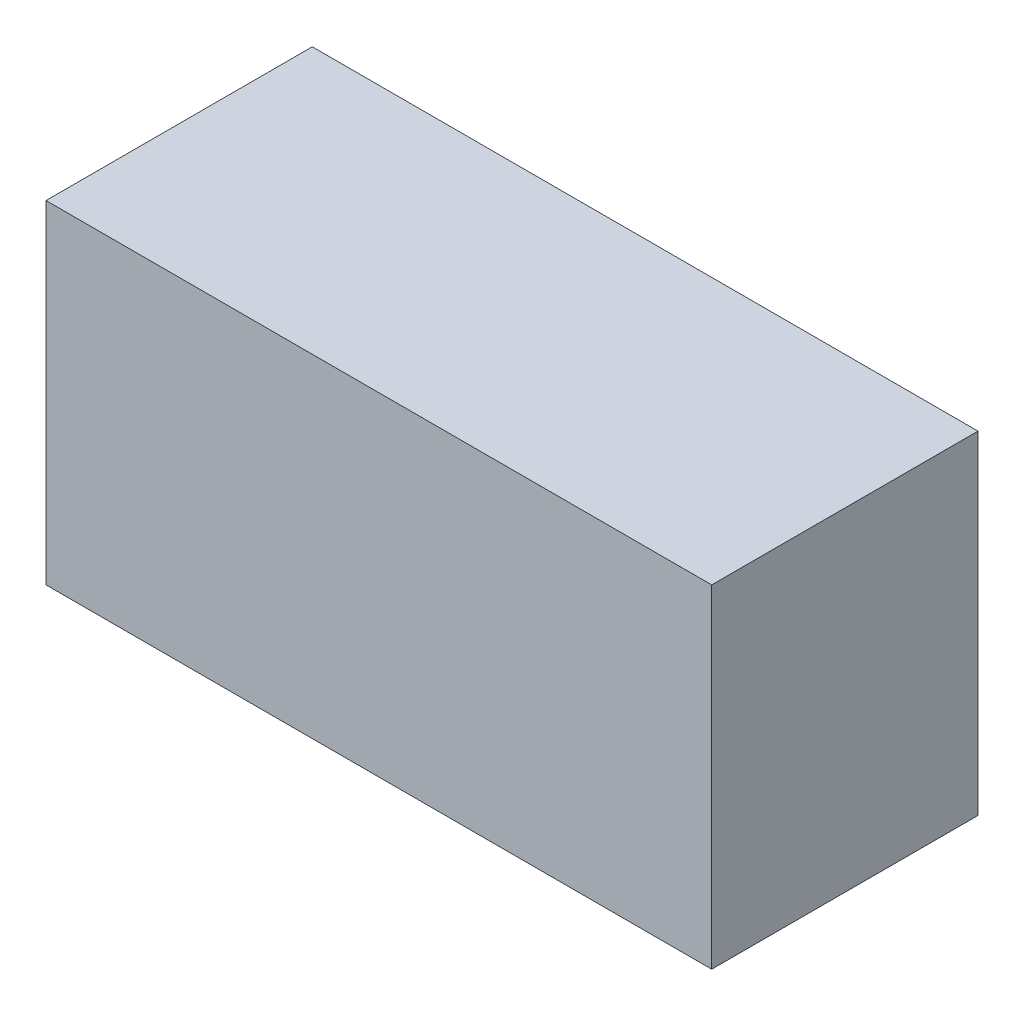
ISO-10303-21;
HEADER;
FILE_DESCRIPTION(('STEP AP214'),'2;1');
FILE_NAME('part.step','',(''),(''),'','','');
FILE_SCHEMA(('AUTOMOTIVE_DESIGN { 1 0 10303 214 1 1 1 1 }'));
ENDSEC;
DATA;
#1=APPLICATION_CONTEXT('core data for automotive mechanical design processes');
#2=APPLICATION_PROTOCOL_DEFINITION('international standard','automotive_design',2000,#1);
#3=PRODUCT_CONTEXT('',#1,'mechanical');
#4=PRODUCT('Part','Part','',(#3));
#5=PRODUCT_RELATED_PRODUCT_CATEGORY('part','',(#4));
#6=PRODUCT_DEFINITION_FORMATION('','',#4);
#7=PRODUCT_DEFINITION_CONTEXT('part definition',#1,'design');
#8=PRODUCT_DEFINITION('design','',#6,#7);
#9=PRODUCT_DEFINITION_SHAPE('','',#8);
#10=(LENGTH_UNIT() NAMED_UNIT(*) SI_UNIT(.MILLI.,.METRE.));
#11=(NAMED_UNIT(*) PLANE_ANGLE_UNIT() SI_UNIT($,.RADIAN.));
#12=(NAMED_UNIT(*) SI_UNIT($,.STERADIAN.) SOLID_ANGLE_UNIT());
#13=UNCERTAINTY_MEASURE_WITH_UNIT(LENGTH_MEASURE(1.E-05),#10,'distance_accuracy_value','');
#14=(GEOMETRIC_REPRESENTATION_CONTEXT(3) GLOBAL_UNCERTAINTY_ASSIGNED_CONTEXT((#13)) GLOBAL_UNIT_ASSIGNED_CONTEXT((#10,
#11,#12)) REPRESENTATION_CONTEXT('',''));
#15=CARTESIAN_POINT('',(0.,0.,0.));
#16=DIRECTION('',(0.,0.,1.));
#17=DIRECTION('',(1.,0.,0.));
#18=AXIS2_PLACEMENT_3D('',#15,#16,#17);
#19=CARTESIAN_POINT('',(100.,50.,80.));
#20=DIRECTION('',(-1.,0.,0.));
#21=DIRECTION('',(0.,0.,1.));
#22=AXIS2_PLACEMENT_3D('',#19,#20,#21);
#23=PLANE('',#22);
#24=DIRECTION('',(0.,1.,0.));
#25=VECTOR('',#24,1.);
#26=CARTESIAN_POINT('',(100.,50.,0.));
#27=LINE('',#26,#25);
#28=CARTESIAN_POINT('',(100.,-50.,0.));
#29=VERTEX_POINT('',#28);
#30=CARTESIAN_POINT('',(100.,50.,0.));
#31=VERTEX_POINT('',#30);
#32=EDGE_CURVE('E141',#29,#31,#27,.T.);
#33=ORIENTED_EDGE('',*,*,#32,.T.);
#34=DIRECTION('',(0.,0.,-1.));
#35=VECTOR('',#34,1.);
#36=CARTESIAN_POINT('',(100.,50.,80.));
#37=LINE('',#36,#35);
#38=CARTESIAN_POINT('',(100.,50.,80.));
#39=VERTEX_POINT('',#38);
#40=EDGE_CURVE('E11',#39,#31,#37,.T.);
#41=ORIENTED_EDGE('',*,*,#40,.F.);
#42=DIRECTION('',(0.,1.,0.));
#43=VECTOR('',#42,1.);
#44=CARTESIAN_POINT('',(100.,50.,80.));
#45=LINE('',#44,#43);
#46=CARTESIAN_POINT('',(100.,-50.,80.));
#47=VERTEX_POINT('',#46);
#48=EDGE_CURVE('E145',#47,#39,#45,.T.);
#49=ORIENTED_EDGE('',*,*,#48,.F.);
#50=DIRECTION('',(0.,0.,-1.));
#51=VECTOR('',#50,1.);
#52=CARTESIAN_POINT('',(100.,-50.,80.));
#53=LINE('',#52,#51);
#54=EDGE_CURVE('E151',#47,#29,#53,.T.);
#55=ORIENTED_EDGE('',*,*,#54,.T.);
#56=EDGE_LOOP('',(#33,#41,#49,#55));
#57=FACE_BOUND('',#56,.T.);
#58=ADVANCED_FACE('F33',(#57),#23,.F.);
#59=CARTESIAN_POINT('',(-100.,50.,80.));
#60=DIRECTION('',(0.,-1.,0.));
#61=DIRECTION('',(0.,0.,-1.));
#62=AXIS2_PLACEMENT_3D('',#59,#60,#61);
#63=PLANE('',#62);
#64=DIRECTION('',(-1.,0.,0.));
#65=VECTOR('',#64,1.);
#66=CARTESIAN_POINT('',(-100.,50.,0.));
#67=LINE('',#66,#65);
#68=CARTESIAN_POINT('',(-100.,50.,0.));
#69=VERTEX_POINT('',#68);
#70=EDGE_CURVE('E154',#31,#69,#67,.T.);
#71=ORIENTED_EDGE('',*,*,#70,.T.);
#72=DIRECTION('',(0.,0.,-1.));
#73=VECTOR('',#72,1.);
#74=CARTESIAN_POINT('',(-100.,50.,80.));
#75=LINE('',#74,#73);
#76=CARTESIAN_POINT('',(-100.,50.,80.));
#77=VERTEX_POINT('',#76);
#78=EDGE_CURVE('E40',#77,#69,#75,.T.);
#79=ORIENTED_EDGE('',*,*,#78,.F.);
#80=DIRECTION('',(-1.,0.,0.));
#81=VECTOR('',#80,1.);
#82=CARTESIAN_POINT('',(-100.,50.,80.));
#83=LINE('',#82,#81);
#84=EDGE_CURVE('E84',#39,#77,#83,.T.);
#85=ORIENTED_EDGE('',*,*,#84,.F.);
#86=ORIENTED_EDGE('',*,*,#40,.T.);
#87=EDGE_LOOP('',(#71,#79,#85,#86));
#88=FACE_BOUND('',#87,.T.);
#89=ADVANCED_FACE('F182',(#88),#63,.F.);
#90=CARTESIAN_POINT('',(-100.,50.,80.));
#91=DIRECTION('',(1.,0.,0.));
#92=DIRECTION('',(0.,0.,-1.));
#93=AXIS2_PLACEMENT_3D('',#90,#91,#92);
#94=PLANE('',#93);
#95=DIRECTION('',(0.,-1.,0.));
#96=VECTOR('',#95,1.);
#97=CARTESIAN_POINT('',(-100.,50.,0.));
#98=LINE('',#97,#96);
#99=CARTESIAN_POINT('',(-100.,-50.,0.));
#100=VERTEX_POINT('',#99);
#101=EDGE_CURVE('E156',#69,#100,#98,.T.);
#102=ORIENTED_EDGE('',*,*,#101,.T.);
#103=DIRECTION('',(0.,0.,-1.));
#104=VECTOR('',#103,1.);
#105=CARTESIAN_POINT('',(-100.,-50.,80.));
#106=LINE('',#105,#104);
#107=CARTESIAN_POINT('',(-100.,-50.,80.));
#108=VERTEX_POINT('',#107);
#109=EDGE_CURVE('E160',#108,#100,#106,.T.);
#110=ORIENTED_EDGE('',*,*,#109,.F.);
#111=DIRECTION('',(0.,-1.,0.));
#112=VECTOR('',#111,1.);
#113=CARTESIAN_POINT('',(-100.,50.,80.));
#114=LINE('',#113,#112);
#115=EDGE_CURVE('E148',#77,#108,#114,.T.);
#116=ORIENTED_EDGE('',*,*,#115,.F.);
#117=ORIENTED_EDGE('',*,*,#78,.T.);
#118=EDGE_LOOP('',(#102,#110,#116,#117));
#119=FACE_BOUND('',#118,.T.);
#120=ADVANCED_FACE('F165',(#119),#94,.F.);
#121=CARTESIAN_POINT('',(-100.,-50.,80.));
#122=DIRECTION('',(0.,1.,0.));
#123=DIRECTION('',(0.,0.,1.));
#124=AXIS2_PLACEMENT_3D('',#121,#122,#123);
#125=PLANE('',#124);
#126=DIRECTION('',(1.,0.,0.));
#127=VECTOR('',#126,1.);
#128=CARTESIAN_POINT('',(-100.,-50.,0.));
#129=LINE('',#128,#127);
#130=EDGE_CURVE('E77',#100,#29,#129,.T.);
#131=ORIENTED_EDGE('',*,*,#130,.T.);
#132=ORIENTED_EDGE('',*,*,#54,.F.);
#133=DIRECTION('',(1.,0.,0.));
#134=VECTOR('',#133,1.);
#135=CARTESIAN_POINT('',(-100.,-50.,80.));
#136=LINE('',#135,#134);
#137=EDGE_CURVE('E56',#108,#47,#136,.T.);
#138=ORIENTED_EDGE('',*,*,#137,.F.);
#139=ORIENTED_EDGE('',*,*,#109,.T.);
#140=EDGE_LOOP('',(#131,#132,#138,#139));
#141=FACE_BOUND('',#140,.T.);
#142=ADVANCED_FACE('F173',(#141),#125,.F.);
#143=CARTESIAN_POINT('',(0.,0.,80.));
#144=DIRECTION('',(0.,0.,1.));
#145=DIRECTION('',(1.,0.,0.));
#146=AXIS2_PLACEMENT_3D('',#143,#144,#145);
#147=PLANE('',#146);
#148=ORIENTED_EDGE('',*,*,#48,.T.);
#149=ORIENTED_EDGE('',*,*,#84,.T.);
#150=ORIENTED_EDGE('',*,*,#115,.T.);
#151=ORIENTED_EDGE('',*,*,#137,.T.);
#152=EDGE_LOOP('',(#148,#149,#150,#151));
#153=FACE_BOUND('',#152,.T.);
#154=ADVANCED_FACE('F175',(#153),#147,.T.);
#155=CARTESIAN_POINT('',(0.,0.,0.));
#156=DIRECTION('',(0.,0.,1.));
#157=DIRECTION('',(1.,0.,0.));
#158=AXIS2_PLACEMENT_3D('',#155,#156,#157);
#159=PLANE('',#158);
#160=DIRECTION('',(1.,0.,0.));
#161=VECTOR('',#160,1.);
#162=CARTESIAN_POINT('',(95.,45.,0.));
#163=LINE('',#162,#161);
#164=CARTESIAN_POINT('',(-95.,45.,0.));
#165=VERTEX_POINT('',#164);
#166=CARTESIAN_POINT('',(95.,45.,0.));
#167=VERTEX_POINT('',#166);
#168=EDGE_CURVE('E135',#165,#167,#163,.T.);
#169=ORIENTED_EDGE('',*,*,#168,.F.);
#170=DIRECTION('',(0.,1.,0.));
#171=VECTOR('',#170,1.);
#172=CARTESIAN_POINT('',(-95.,45.,0.));
#173=LINE('',#172,#171);
#174=CARTESIAN_POINT('',(-95.,-45.,0.));
#175=VERTEX_POINT('',#174);
#176=EDGE_CURVE('E47',#175,#165,#173,.T.);
#177=ORIENTED_EDGE('',*,*,#176,.F.);
#178=DIRECTION('',(-1.,0.,0.));
#179=VECTOR('',#178,1.);
#180=CARTESIAN_POINT('',(95.,-45.,0.));
#181=LINE('',#180,#179);
#182=CARTESIAN_POINT('',(95.,-45.,0.));
#183=VERTEX_POINT('',#182);
#184=EDGE_CURVE('E126',#183,#175,#181,.T.);
#185=ORIENTED_EDGE('',*,*,#184,.F.);
#186=DIRECTION('',(0.,-1.,0.));
#187=VECTOR('',#186,1.);
#188=CARTESIAN_POINT('',(95.,45.,0.));
#189=LINE('',#188,#187);
#190=EDGE_CURVE('E129',#167,#183,#189,.T.);
#191=ORIENTED_EDGE('',*,*,#190,.F.);
#192=EDGE_LOOP('',(#169,#177,#185,#191));
#193=FACE_BOUND('',#192,.T.);
#194=ORIENTED_EDGE('',*,*,#32,.F.);
#195=ORIENTED_EDGE('',*,*,#130,.F.);
#196=ORIENTED_EDGE('',*,*,#101,.F.);
#197=ORIENTED_EDGE('',*,*,#70,.F.);
#198=EDGE_LOOP('',(#194,#195,#196,#197));
#199=FACE_BOUND('',#198,.T.);
#200=ADVANCED_FACE('F169',(#193,#199),#159,.F.);
#201=CARTESIAN_POINT('',(-95.,45.,75.));
#202=DIRECTION('',(-1.,0.,0.));
#203=DIRECTION('',(0.,0.,1.));
#204=AXIS2_PLACEMENT_3D('',#201,#202,#203);
#205=PLANE('',#204);
#206=ORIENTED_EDGE('',*,*,#176,.T.);
#207=DIRECTION('',(0.,0.,-1.));
#208=VECTOR('',#207,1.);
#209=CARTESIAN_POINT('',(-95.,45.,75.));
#210=LINE('',#209,#208);
#211=CARTESIAN_POINT('',(-95.,45.,75.));
#212=VERTEX_POINT('',#211);
#213=EDGE_CURVE('E104',#212,#165,#210,.T.);
#214=ORIENTED_EDGE('',*,*,#213,.F.);
#215=DIRECTION('',(0.,1.,0.));
#216=VECTOR('',#215,1.);
#217=CARTESIAN_POINT('',(-95.,45.,75.));
#218=LINE('',#217,#216);
#219=CARTESIAN_POINT('',(-95.,-45.,75.));
#220=VERTEX_POINT('',#219);
#221=EDGE_CURVE('E108',#220,#212,#218,.T.);
#222=ORIENTED_EDGE('',*,*,#221,.F.);
#223=DIRECTION('',(0.,0.,-1.));
#224=VECTOR('',#223,1.);
#225=CARTESIAN_POINT('',(-95.,-45.,75.));
#226=LINE('',#225,#224);
#227=EDGE_CURVE('E139',#220,#175,#226,.T.);
#228=ORIENTED_EDGE('',*,*,#227,.T.);
#229=EDGE_LOOP('',(#206,#214,#222,#228));
#230=FACE_BOUND('',#229,.T.);
#231=ADVANCED_FACE('F106',(#230),#205,.F.);
#232=CARTESIAN_POINT('',(95.,-45.,75.));
#233=DIRECTION('',(0.,-1.,0.));
#234=DIRECTION('',(0.,0.,-1.));
#235=AXIS2_PLACEMENT_3D('',#232,#233,#234);
#236=PLANE('',#235);
#237=ORIENTED_EDGE('',*,*,#184,.T.);
#238=ORIENTED_EDGE('',*,*,#227,.F.);
#239=DIRECTION('',(-1.,0.,0.));
#240=VECTOR('',#239,1.);
#241=CARTESIAN_POINT('',(95.,-45.,75.));
#242=LINE('',#241,#240);
#243=CARTESIAN_POINT('',(95.,-45.,75.));
#244=VERTEX_POINT('',#243);
#245=EDGE_CURVE('E114',#244,#220,#242,.T.);
#246=ORIENTED_EDGE('',*,*,#245,.F.);
#247=DIRECTION('',(0.,0.,-1.));
#248=VECTOR('',#247,1.);
#249=CARTESIAN_POINT('',(95.,-45.,75.));
#250=LINE('',#249,#248);
#251=EDGE_CURVE('E142',#244,#183,#250,.T.);
#252=ORIENTED_EDGE('',*,*,#251,.T.);
#253=EDGE_LOOP('',(#237,#238,#246,#252));
#254=FACE_BOUND('',#253,.T.);
#255=ADVANCED_FACE('F222',(#254),#236,.F.);
#256=CARTESIAN_POINT('',(95.,45.,75.));
#257=DIRECTION('',(1.,0.,0.));
#258=DIRECTION('',(0.,0.,-1.));
#259=AXIS2_PLACEMENT_3D('',#256,#257,#258);
#260=PLANE('',#259);
#261=ORIENTED_EDGE('',*,*,#190,.T.);
#262=ORIENTED_EDGE('',*,*,#251,.F.);
#263=DIRECTION('',(0.,-1.,0.));
#264=VECTOR('',#263,1.);
#265=CARTESIAN_POINT('',(95.,45.,75.));
#266=LINE('',#265,#264);
#267=CARTESIAN_POINT('',(95.,45.,75.));
#268=VERTEX_POINT('',#267);
#269=EDGE_CURVE('E122',#268,#244,#266,.T.);
#270=ORIENTED_EDGE('',*,*,#269,.F.);
#271=DIRECTION('',(0.,0.,-1.));
#272=VECTOR('',#271,1.);
#273=CARTESIAN_POINT('',(95.,45.,75.));
#274=LINE('',#273,#272);
#275=EDGE_CURVE('E113',#268,#167,#274,.T.);
#276=ORIENTED_EDGE('',*,*,#275,.T.);
#277=EDGE_LOOP('',(#261,#262,#270,#276));
#278=FACE_BOUND('',#277,.T.);
#279=ADVANCED_FACE('F231',(#278),#260,.F.);
#280=CARTESIAN_POINT('',(95.,45.,75.));
#281=DIRECTION('',(0.,1.,0.));
#282=DIRECTION('',(0.,0.,1.));
#283=AXIS2_PLACEMENT_3D('',#280,#281,#282);
#284=PLANE('',#283);
#285=ORIENTED_EDGE('',*,*,#168,.T.);
#286=ORIENTED_EDGE('',*,*,#275,.F.);
#287=DIRECTION('',(1.,0.,0.));
#288=VECTOR('',#287,1.);
#289=CARTESIAN_POINT('',(95.,45.,75.));
#290=LINE('',#289,#288);
#291=EDGE_CURVE('E117',#212,#268,#290,.T.);
#292=ORIENTED_EDGE('',*,*,#291,.F.);
#293=ORIENTED_EDGE('',*,*,#213,.T.);
#294=EDGE_LOOP('',(#285,#286,#292,#293));
#295=FACE_BOUND('',#294,.T.);
#296=ADVANCED_FACE('F118',(#295),#284,.F.);
#297=CARTESIAN_POINT('',(0.,0.,75.));
#298=DIRECTION('',(0.,0.,-1.));
#299=DIRECTION('',(-1.,0.,0.));
#300=AXIS2_PLACEMENT_3D('',#297,#298,#299);
#301=PLANE('',#300);
#302=ORIENTED_EDGE('',*,*,#221,.T.);
#303=ORIENTED_EDGE('',*,*,#291,.T.);
#304=ORIENTED_EDGE('',*,*,#269,.T.);
#305=ORIENTED_EDGE('',*,*,#245,.T.);
#306=EDGE_LOOP('',(#302,#303,#304,#305));
#307=FACE_BOUND('',#306,.T.);
#308=ADVANCED_FACE('F124',(#307),#301,.T.);
#309=CLOSED_SHELL('',(#58,#89,#120,#142,#154,#200,#231,#255,#279,#296,#308));
#310=MANIFOLD_SOLID_BREP('B2',#309);
#311=ADVANCED_BREP_SHAPE_REPRESENTATION('',(#18,#310),#14);
#312=SHAPE_DEFINITION_REPRESENTATION(#9,#311);
ENDSEC;
END-ISO-10303-21;
